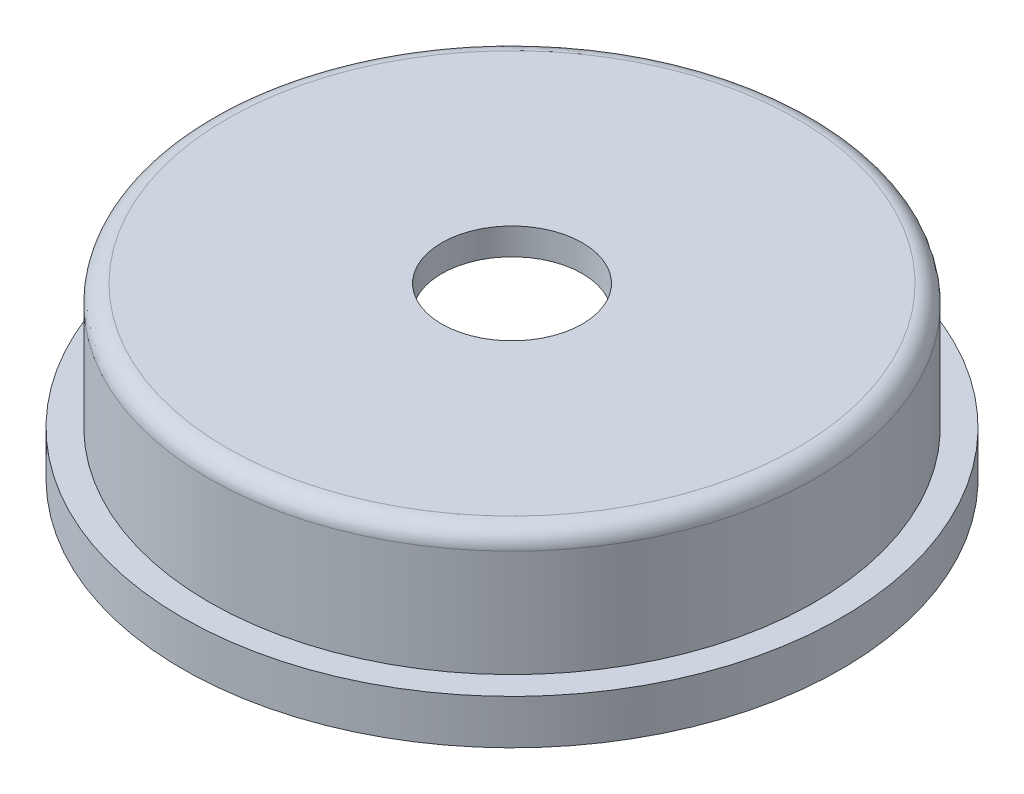
ISO-10303-21;
HEADER;
FILE_DESCRIPTION(('STEP AP214'),'2;1');
FILE_NAME('part.step','',(''),(''),'','','');
FILE_SCHEMA(('AUTOMOTIVE_DESIGN { 1 0 10303 214 1 1 1 1 }'));
ENDSEC;
DATA;
#1=APPLICATION_CONTEXT('core data for automotive mechanical design processes');
#2=APPLICATION_PROTOCOL_DEFINITION('international standard','automotive_design',2000,#1);
#3=PRODUCT_CONTEXT('',#1,'mechanical');
#4=PRODUCT('Part','Part','',(#3));
#5=PRODUCT_RELATED_PRODUCT_CATEGORY('part','',(#4));
#6=PRODUCT_DEFINITION_FORMATION('','',#4);
#7=PRODUCT_DEFINITION_CONTEXT('part definition',#1,'design');
#8=PRODUCT_DEFINITION('design','',#6,#7);
#9=PRODUCT_DEFINITION_SHAPE('','',#8);
#10=(LENGTH_UNIT() NAMED_UNIT(*) SI_UNIT(.MILLI.,.METRE.));
#11=(NAMED_UNIT(*) PLANE_ANGLE_UNIT() SI_UNIT($,.RADIAN.));
#12=(NAMED_UNIT(*) SI_UNIT($,.STERADIAN.) SOLID_ANGLE_UNIT());
#13=UNCERTAINTY_MEASURE_WITH_UNIT(LENGTH_MEASURE(1.E-05),#10,'distance_accuracy_value','');
#14=(GEOMETRIC_REPRESENTATION_CONTEXT(3) GLOBAL_UNCERTAINTY_ASSIGNED_CONTEXT((#13)) GLOBAL_UNIT_ASSIGNED_CONTEXT((#10,
#11,#12)) REPRESENTATION_CONTEXT('',''));
#15=CARTESIAN_POINT('',(0.,0.,0.));
#16=DIRECTION('',(0.,0.,1.));
#17=DIRECTION('',(1.,0.,0.));
#18=AXIS2_PLACEMENT_3D('',#15,#16,#17);
#19=CARTESIAN_POINT('',(0.,13.5,0.));
#20=DIRECTION('',(0.,-1.,0.));
#21=DIRECTION('',(0.,0.,-1.));
#22=AXIS2_PLACEMENT_3D('',#19,#20,#21);
#23=CYLINDRICAL_SURFACE('',#22,3.95);
#24=CARTESIAN_POINT('',(0.,6.5,0.));
#25=DIRECTION('',(0.,-1.,0.));
#26=DIRECTION('',(0.,0.,-1.));
#27=AXIS2_PLACEMENT_3D('',#24,#25,#26);
#28=CIRCLE('',#27,3.95);
#29=CARTESIAN_POINT('',(0.,6.5,-3.95));
#30=VERTEX_POINT('',#29);
#31=EDGE_CURVE('E48',#30,#30,#28,.T.);
#32=ORIENTED_EDGE('',*,*,#31,.T.);
#33=EDGE_LOOP('',(#32));
#34=FACE_BOUND('',#33,.T.);
#35=CARTESIAN_POINT('',(0.,8.,0.));
#36=DIRECTION('',(0.,1.,0.));
#37=DIRECTION('',(0.,0.,1.));
#38=AXIS2_PLACEMENT_3D('',#35,#36,#37);
#39=CIRCLE('',#38,3.95);
#40=CARTESIAN_POINT('',(0.,8.,3.95));
#41=VERTEX_POINT('',#40);
#42=EDGE_CURVE('E65',#41,#41,#39,.F.);
#43=ORIENTED_EDGE('',*,*,#42,.F.);
#44=EDGE_LOOP('',(#43));
#45=FACE_BOUND('',#44,.T.);
#46=ADVANCED_FACE('F33',(#34,#45),#23,.F.);
#47=CARTESIAN_POINT('',(0.,20.,0.));
#48=DIRECTION('',(0.,-1.,0.));
#49=DIRECTION('',(0.,0.,-1.));
#50=AXIS2_PLACEMENT_3D('',#47,#48,#49);
#51=CYLINDRICAL_SURFACE('',#50,18.5);
#52=CARTESIAN_POINT('',(0.,1.,0.));
#53=DIRECTION('',(0.,1.,0.));
#54=DIRECTION('',(0.,0.,1.));
#55=AXIS2_PLACEMENT_3D('',#52,#53,#54);
#56=CIRCLE('',#55,18.5);
#57=CARTESIAN_POINT('',(0.,1.,18.5));
#58=VERTEX_POINT('',#57);
#59=EDGE_CURVE('E51',#58,#58,#56,.T.);
#60=ORIENTED_EDGE('',*,*,#59,.F.);
#61=EDGE_LOOP('',(#60));
#62=FACE_BOUND('',#61,.T.);
#63=CARTESIAN_POINT('',(0.,-1.5,0.));
#64=DIRECTION('',(0.,-1.,0.));
#65=DIRECTION('',(0.,0.,-1.));
#66=AXIS2_PLACEMENT_3D('',#63,#64,#65);
#67=CIRCLE('',#66,18.5);
#68=CARTESIAN_POINT('',(0.,-1.5,-18.5));
#69=VERTEX_POINT('',#68);
#70=EDGE_CURVE('E59',#69,#69,#67,.T.);
#71=ORIENTED_EDGE('',*,*,#70,.F.);
#72=EDGE_LOOP('',(#71));
#73=FACE_BOUND('',#72,.T.);
#74=ADVANCED_FACE('F72',(#62,#73),#51,.T.);
#75=CARTESIAN_POINT('',(0.,6.5,0.));
#76=DIRECTION('',(0.,-1.,0.));
#77=DIRECTION('',(0.,0.,-1.));
#78=AXIS2_PLACEMENT_3D('',#75,#76,#77);
#79=CYLINDRICAL_SURFACE('',#78,16.);
#80=CARTESIAN_POINT('',(0.,6.5,0.));
#81=DIRECTION('',(0.,-1.,0.));
#82=DIRECTION('',(0.,0.,-1.));
#83=AXIS2_PLACEMENT_3D('',#80,#81,#82);
#84=CIRCLE('',#83,16.);
#85=CARTESIAN_POINT('',(0.,6.5,-16.));
#86=VERTEX_POINT('',#85);
#87=EDGE_CURVE('E44',#86,#86,#84,.T.);
#88=CARTESIAN_POINT('',(0.,-1.5,0.));
#89=DIRECTION('',(0.,-1.,0.));
#90=DIRECTION('',(0.,0.,-1.));
#91=AXIS2_PLACEMENT_3D('',#88,#89,#90);
#92=CIRCLE('',#91,16.);
#93=CARTESIAN_POINT('',(0.,-1.5,-16.));
#94=VERTEX_POINT('',#93);
#95=EDGE_CURVE('E62',#94,#94,#92,.T.);
#96=CARTESIAN_POINT('',(0.,6.5,-16.));
#97=CARTESIAN_POINT('',(0.,6.41666666666667,-16.));
#98=CARTESIAN_POINT('',(0.,6.33333333333333,-16.));
#99=CARTESIAN_POINT('',(0.,6.16666666666667,-16.));
#100=CARTESIAN_POINT('',(0.,6.08333333333333,-16.));
#101=CARTESIAN_POINT('',(0.,5.91666666666667,-16.));
#102=CARTESIAN_POINT('',(0.,5.83333333333333,-16.));
#103=CARTESIAN_POINT('',(0.,5.66666666666667,-16.));
#104=CARTESIAN_POINT('',(0.,5.58333333333333,-16.));
#105=CARTESIAN_POINT('',(0.,5.41666666666667,-16.));
#106=CARTESIAN_POINT('',(0.,5.33333333333333,-16.));
#107=CARTESIAN_POINT('',(0.,5.16666666666667,-16.));
#108=CARTESIAN_POINT('',(0.,5.08333333333333,-16.));
#109=CARTESIAN_POINT('',(0.,4.91666666666667,-16.));
#110=CARTESIAN_POINT('',(0.,4.83333333333333,-16.));
#111=CARTESIAN_POINT('',(0.,4.66666666666667,-16.));
#112=CARTESIAN_POINT('',(0.,4.58333333333333,-16.));
#113=CARTESIAN_POINT('',(0.,4.41666666666667,-16.));
#114=CARTESIAN_POINT('',(0.,4.33333333333333,-16.));
#115=CARTESIAN_POINT('',(0.,4.16666666666667,-16.));
#116=CARTESIAN_POINT('',(0.,4.08333333333333,-16.));
#117=CARTESIAN_POINT('',(0.,3.91666666666667,-16.));
#118=CARTESIAN_POINT('',(0.,3.83333333333333,-16.));
#119=CARTESIAN_POINT('',(0.,3.66666666666667,-16.));
#120=CARTESIAN_POINT('',(0.,3.58333333333333,-16.));
#121=CARTESIAN_POINT('',(0.,3.41666666666667,-16.));
#122=CARTESIAN_POINT('',(0.,3.33333333333333,-16.));
#123=CARTESIAN_POINT('',(0.,3.16666666666667,-16.));
#124=CARTESIAN_POINT('',(0.,3.08333333333333,-16.));
#125=CARTESIAN_POINT('',(0.,2.91666666666667,-16.));
#126=CARTESIAN_POINT('',(0.,2.83333333333333,-16.));
#127=CARTESIAN_POINT('',(0.,2.66666666666667,-16.));
#128=CARTESIAN_POINT('',(0.,2.58333333333333,-16.));
#129=CARTESIAN_POINT('',(0.,2.41666666666667,-16.));
#130=CARTESIAN_POINT('',(0.,2.33333333333333,-16.));
#131=CARTESIAN_POINT('',(0.,2.16666666666667,-16.));
#132=CARTESIAN_POINT('',(0.,2.08333333333333,-16.));
#133=CARTESIAN_POINT('',(0.,1.91666666666667,-16.));
#134=CARTESIAN_POINT('',(0.,1.83333333333333,-16.));
#135=CARTESIAN_POINT('',(0.,1.66666666666667,-16.));
#136=CARTESIAN_POINT('',(0.,1.58333333333333,-16.));
#137=CARTESIAN_POINT('',(0.,1.41666666666667,-16.));
#138=CARTESIAN_POINT('',(0.,1.33333333333333,-16.));
#139=CARTESIAN_POINT('',(0.,1.16666666666667,-16.));
#140=CARTESIAN_POINT('',(0.,1.08333333333333,-16.));
#141=CARTESIAN_POINT('',(0.,0.916666666666668,-16.));
#142=CARTESIAN_POINT('',(0.,0.833333333333335,-16.));
#143=CARTESIAN_POINT('',(0.,0.666666666666668,-16.));
#144=CARTESIAN_POINT('',(0.,0.583333333333335,-16.));
#145=CARTESIAN_POINT('',(0.,0.416666666666668,-16.));
#146=CARTESIAN_POINT('',(0.,0.333333333333334,-16.));
#147=CARTESIAN_POINT('',(0.,0.166666666666668,-16.));
#148=CARTESIAN_POINT('',(0.,0.0833333333333343,-16.));
#149=CARTESIAN_POINT('',(0.,-0.0833333333333322,-16.));
#150=CARTESIAN_POINT('',(0.,-0.166666666666665,-16.));
#151=CARTESIAN_POINT('',(0.,-0.333333333333332,-16.));
#152=CARTESIAN_POINT('',(0.,-0.416666666666665,-16.));
#153=CARTESIAN_POINT('',(0.,-0.583333333333332,-16.));
#154=CARTESIAN_POINT('',(0.,-0.666666666666666,-16.));
#155=CARTESIAN_POINT('',(0.,-0.833333333333332,-16.));
#156=CARTESIAN_POINT('',(0.,-0.916666666666665,-16.));
#157=CARTESIAN_POINT('',(0.,-1.08333333333333,-16.));
#158=CARTESIAN_POINT('',(0.,-1.16666666666666,-16.));
#159=CARTESIAN_POINT('',(0.,-1.33333333333333,-16.));
#160=CARTESIAN_POINT('',(0.,-1.41666666666667,-16.));
#161=CARTESIAN_POINT('',(0.,-1.5,-16.));
#162=B_SPLINE_CURVE_WITH_KNOTS('',3,(#96,#97,#98,#99,#100,#101,#102,#103,#104,#105,#106,#107,
#108,#109,#110,#111,#112,#113,#114,#115,#116,#117,#118,#119,#120,#121,#122,#123,#124,#125,#126,
#127,#128,#129,#130,#131,#132,#133,#134,#135,#136,#137,#138,#139,#140,#141,#142,#143,#144,#145,
#146,#147,#148,#149,#150,#151,#152,#153,#154,#155,#156,#157,#158,#159,#160,#161),.UNSPECIFIED.,
.F.,.F.,(4,2,2,2,2,2,2,2,2,2,2,2,2,2,2,2,2,2,2,2,2,2,2,2,2,2,2,2,2,2,2,2,4),(0.,0.25,0.5,
0.750000000000001,1.,1.25,1.5,1.75,2.,2.25,2.5,2.75,3.,3.25,3.5,3.75,4.,4.25,4.5,4.75,5.,5.25,
5.5,5.75,6.,6.25,6.5,6.75,7.,7.25,7.5,7.75,8.),.UNSPECIFIED.);
#163=EDGE_CURVE('BSEAM78',#86,#94,#162,.T.);
#164=ORIENTED_EDGE('',*,*,#87,.F.);
#165=ORIENTED_EDGE('',*,*,#95,.T.);
#166=ORIENTED_EDGE('',*,*,#163,.T.);
#167=ORIENTED_EDGE('',*,*,#163,.F.);
#168=EDGE_LOOP('',(#164,#166,#165,#167));
#169=FACE_BOUND('',#168,.T.);
#170=ADVANCED_FACE('F78',(#169),#79,.F.);
#171=CARTESIAN_POINT('',(0.,6.5,0.));
#172=DIRECTION('',(0.,-1.,0.));
#173=DIRECTION('',(0.,0.,-1.));
#174=AXIS2_PLACEMENT_3D('',#171,#172,#173);
#175=PLANE('',#174);
#176=ORIENTED_EDGE('',*,*,#31,.F.);
#177=EDGE_LOOP('',(#176));
#178=FACE_BOUND('',#177,.T.);
#179=ORIENTED_EDGE('',*,*,#87,.T.);
#180=EDGE_LOOP('',(#179));
#181=FACE_BOUND('',#180,.T.);
#182=ADVANCED_FACE('F84',(#178,#181),#175,.T.);
#183=CARTESIAN_POINT('',(0.,1.,0.));
#184=DIRECTION('',(0.,1.,0.));
#185=DIRECTION('',(0.,0.,1.));
#186=AXIS2_PLACEMENT_3D('',#183,#184,#185);
#187=PLANE('',#186);
#188=CARTESIAN_POINT('',(0.,1.,0.));
#189=DIRECTION('',(0.,1.,0.));
#190=DIRECTION('',(0.,0.,1.));
#191=AXIS2_PLACEMENT_3D('',#188,#189,#190);
#192=CIRCLE('',#191,17.);
#193=CARTESIAN_POINT('',(0.,1.,17.));
#194=VERTEX_POINT('',#193);
#195=EDGE_CURVE('E53',#194,#194,#192,.T.);
#196=ORIENTED_EDGE('',*,*,#195,.F.);
#197=EDGE_LOOP('',(#196));
#198=FACE_BOUND('',#197,.T.);
#199=ORIENTED_EDGE('',*,*,#59,.T.);
#200=EDGE_LOOP('',(#199));
#201=FACE_BOUND('',#200,.T.);
#202=ADVANCED_FACE('F82',(#198,#201),#187,.T.);
#203=CARTESIAN_POINT('',(0.,1.,0.));
#204=DIRECTION('',(0.,1.,0.));
#205=DIRECTION('',(0.,0.,1.));
#206=AXIS2_PLACEMENT_3D('',#203,#204,#205);
#207=CYLINDRICAL_SURFACE('',#206,17.);
#208=CARTESIAN_POINT('',(0.,7.,0.));
#209=DIRECTION('',(0.,1.,0.));
#210=DIRECTION('',(0.,0.,1.));
#211=AXIS2_PLACEMENT_3D('',#208,#209,#210);
#212=CIRCLE('',#211,17.);
#213=CARTESIAN_POINT('',(0.,7.,17.));
#214=VERTEX_POINT('',#213);
#215=EDGE_CURVE('E11',#214,#214,#212,.F.);
#216=ORIENTED_EDGE('',*,*,#215,.T.);
#217=EDGE_LOOP('',(#216));
#218=FACE_BOUND('',#217,.T.);
#219=ORIENTED_EDGE('',*,*,#195,.T.);
#220=EDGE_LOOP('',(#219));
#221=FACE_BOUND('',#220,.T.);
#222=ADVANCED_FACE('F106',(#218,#221),#207,.T.);
#223=CARTESIAN_POINT('',(0.,8.,0.));
#224=DIRECTION('',(0.,1.,0.));
#225=DIRECTION('',(0.,0.,1.));
#226=AXIS2_PLACEMENT_3D('',#223,#224,#225);
#227=PLANE('',#226);
#228=CARTESIAN_POINT('',(0.,8.,0.));
#229=DIRECTION('',(0.,1.,0.));
#230=DIRECTION('',(0.,0.,1.));
#231=AXIS2_PLACEMENT_3D('',#228,#229,#230);
#232=CIRCLE('',#231,16.);
#233=CARTESIAN_POINT('',(0.,8.,16.));
#234=VERTEX_POINT('',#233);
#235=EDGE_CURVE('E40',#234,#234,#232,.T.);
#236=ORIENTED_EDGE('',*,*,#235,.T.);
#237=EDGE_LOOP('',(#236));
#238=FACE_BOUND('',#237,.T.);
#239=ORIENTED_EDGE('',*,*,#42,.T.);
#240=EDGE_LOOP('',(#239));
#241=FACE_BOUND('',#240,.T.);
#242=ADVANCED_FACE('F69',(#238,#241),#227,.T.);
#243=CARTESIAN_POINT('',(0.,7.,0.));
#244=DIRECTION('',(0.,1.,0.));
#245=DIRECTION('',(0.,0.,1.));
#246=AXIS2_PLACEMENT_3D('',#243,#244,#245);
#247=TOROIDAL_SURFACE('',#246,16.,1.);
#248=ORIENTED_EDGE('',*,*,#215,.F.);
#249=EDGE_LOOP('',(#248));
#250=FACE_BOUND('',#249,.T.);
#251=ORIENTED_EDGE('',*,*,#235,.F.);
#252=EDGE_LOOP('',(#251));
#253=FACE_BOUND('',#252,.T.);
#254=ADVANCED_FACE('F35',(#250,#253),#247,.T.);
#255=CARTESIAN_POINT('',(0.,-1.5,0.));
#256=DIRECTION('',(0.,-1.,0.));
#257=DIRECTION('',(0.,0.,-1.));
#258=AXIS2_PLACEMENT_3D('',#255,#256,#257);
#259=PLANE('',#258);
#260=ORIENTED_EDGE('',*,*,#70,.T.);
#261=EDGE_LOOP('',(#260));
#262=FACE_BOUND('',#261,.T.);
#263=ORIENTED_EDGE('',*,*,#95,.F.);
#264=EDGE_LOOP('',(#263));
#265=FACE_BOUND('',#264,.T.);
#266=ADVANCED_FACE('F96',(#262,#265),#259,.T.);
#267=CLOSED_SHELL('',(#46,#74,#170,#182,#202,#222,#242,#254,#266));
#268=MANIFOLD_SOLID_BREP('B2',#267);
#269=ADVANCED_BREP_SHAPE_REPRESENTATION('',(#18,#268),#14);
#270=SHAPE_DEFINITION_REPRESENTATION(#9,#269);
ENDSEC;
END-ISO-10303-21;
